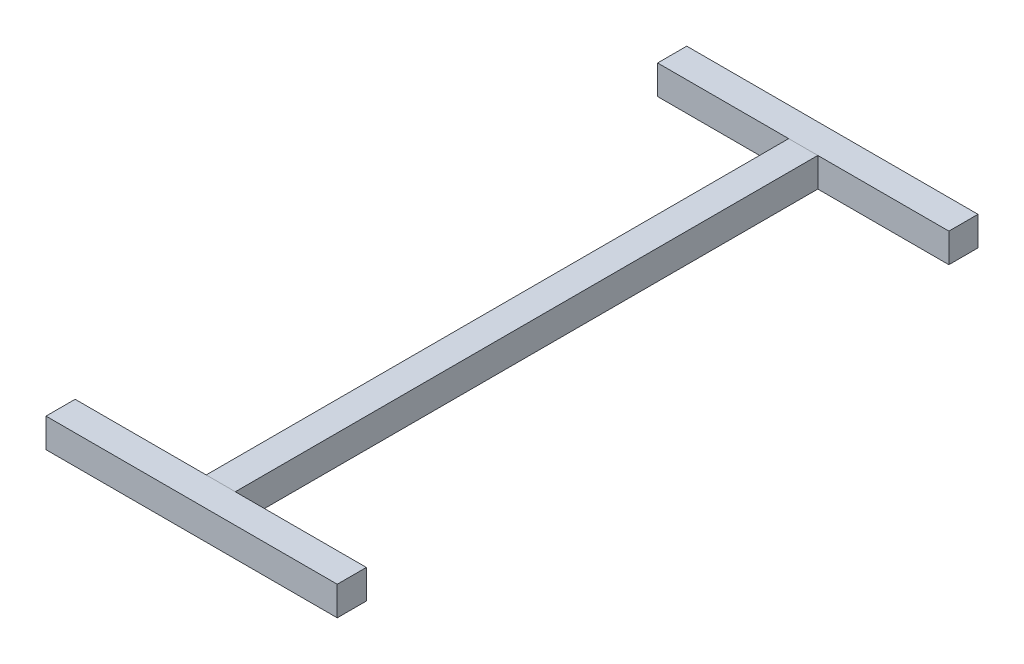
ISO-10303-21;
HEADER;
FILE_DESCRIPTION(('STEP AP214'),'2;1');
FILE_NAME('part.step','',(''),(''),'','','');
FILE_SCHEMA(('AUTOMOTIVE_DESIGN { 1 0 10303 214 1 1 1 1 }'));
ENDSEC;
DATA;
#1=APPLICATION_CONTEXT('core data for automotive mechanical design processes');
#2=APPLICATION_PROTOCOL_DEFINITION('international standard','automotive_design',2000,#1);
#3=PRODUCT_CONTEXT('',#1,'mechanical');
#4=PRODUCT('Part','Part','',(#3));
#5=PRODUCT_RELATED_PRODUCT_CATEGORY('part','',(#4));
#6=PRODUCT_DEFINITION_FORMATION('','',#4);
#7=PRODUCT_DEFINITION_CONTEXT('part definition',#1,'design');
#8=PRODUCT_DEFINITION('design','',#6,#7);
#9=PRODUCT_DEFINITION_SHAPE('','',#8);
#10=(LENGTH_UNIT() NAMED_UNIT(*) SI_UNIT(.MILLI.,.METRE.));
#11=(NAMED_UNIT(*) PLANE_ANGLE_UNIT() SI_UNIT($,.RADIAN.));
#12=(NAMED_UNIT(*) SI_UNIT($,.STERADIAN.) SOLID_ANGLE_UNIT());
#13=UNCERTAINTY_MEASURE_WITH_UNIT(LENGTH_MEASURE(1.E-05),#10,'distance_accuracy_value','');
#14=(GEOMETRIC_REPRESENTATION_CONTEXT(3) GLOBAL_UNCERTAINTY_ASSIGNED_CONTEXT((#13)) GLOBAL_UNIT_ASSIGNED_CONTEXT((#10,
#11,#12)) REPRESENTATION_CONTEXT('',''));
#15=CARTESIAN_POINT('',(0.,0.,0.));
#16=DIRECTION('',(0.,0.,1.));
#17=DIRECTION('',(1.,0.,0.));
#18=AXIS2_PLACEMENT_3D('',#15,#16,#17);
#19=CARTESIAN_POINT('',(100.,10.,200.));
#20=DIRECTION('',(0.,0.,1.));
#21=DIRECTION('',(-1.,0.,0.));
#22=AXIS2_PLACEMENT_3D('',#19,#20,#21);
#23=PLANE('',#22);
#24=DIRECTION('',(0.,-1.,0.));
#25=VECTOR('',#24,1.);
#26=CARTESIAN_POINT('',(-100.,10.,200.));
#27=LINE('',#26,#25);
#28=CARTESIAN_POINT('',(-100.,10.,200.));
#29=VERTEX_POINT('',#28);
#30=CARTESIAN_POINT('',(-100.,-10.,200.));
#31=VERTEX_POINT('',#30);
#32=EDGE_CURVE('E110',#29,#31,#27,.T.);
#33=ORIENTED_EDGE('',*,*,#32,.F.);
#34=DIRECTION('',(-1.,0.,0.));
#35=VECTOR('',#34,1.);
#36=CARTESIAN_POINT('',(100.,10.,200.));
#37=LINE('',#36,#35);
#38=CARTESIAN_POINT('',(100.,10.,200.));
#39=VERTEX_POINT('',#38);
#40=EDGE_CURVE('E109',#39,#29,#37,.T.);
#41=ORIENTED_EDGE('',*,*,#40,.F.);
#42=DIRECTION('',(0.,-1.,0.));
#43=VECTOR('',#42,1.);
#44=CARTESIAN_POINT('',(100.,10.,200.));
#45=LINE('',#44,#43);
#46=CARTESIAN_POINT('',(100.,-10.,200.));
#47=VERTEX_POINT('',#46);
#48=EDGE_CURVE('E104',#39,#47,#45,.T.);
#49=ORIENTED_EDGE('',*,*,#48,.T.);
#50=DIRECTION('',(-1.,0.,0.));
#51=VECTOR('',#50,1.);
#52=CARTESIAN_POINT('',(100.,-10.,200.));
#53=LINE('',#52,#51);
#54=EDGE_CURVE('E12',#47,#31,#53,.T.);
#55=ORIENTED_EDGE('',*,*,#54,.T.);
#56=EDGE_LOOP('',(#33,#41,#49,#55));
#57=FACE_BOUND('',#56,.T.);
#58=ADVANCED_FACE('F47',(#57),#23,.F.);
#59=CARTESIAN_POINT('',(100.,-10.,200.));
#60=DIRECTION('',(0.,1.,0.));
#61=DIRECTION('',(0.,0.,-1.));
#62=AXIS2_PLACEMENT_3D('',#59,#60,#61);
#63=PLANE('',#62);
#64=DIRECTION('',(0.,0.,1.));
#65=VECTOR('',#64,1.);
#66=CARTESIAN_POINT('',(-100.,-10.,200.));
#67=LINE('',#66,#65);
#68=CARTESIAN_POINT('',(-100.,-10.,220.));
#69=VERTEX_POINT('',#68);
#70=EDGE_CURVE('E112',#31,#69,#67,.T.);
#71=ORIENTED_EDGE('',*,*,#70,.F.);
#72=ORIENTED_EDGE('',*,*,#54,.F.);
#73=DIRECTION('',(0.,0.,1.));
#74=VECTOR('',#73,1.);
#75=CARTESIAN_POINT('',(100.,-10.,200.));
#76=LINE('',#75,#74);
#77=CARTESIAN_POINT('',(100.,-10.,220.));
#78=VERTEX_POINT('',#77);
#79=EDGE_CURVE('E88',#47,#78,#76,.T.);
#80=ORIENTED_EDGE('',*,*,#79,.T.);
#81=DIRECTION('',(-1.,0.,0.));
#82=VECTOR('',#81,1.);
#83=CARTESIAN_POINT('',(100.,-10.,220.));
#84=LINE('',#83,#82);
#85=EDGE_CURVE('E55',#78,#69,#84,.T.);
#86=ORIENTED_EDGE('',*,*,#85,.T.);
#87=EDGE_LOOP('',(#71,#72,#80,#86));
#88=FACE_BOUND('',#87,.T.);
#89=ADVANCED_FACE('F102',(#88),#63,.F.);
#90=CARTESIAN_POINT('',(100.,10.,220.));
#91=DIRECTION('',(0.,0.,-1.));
#92=DIRECTION('',(1.,0.,0.));
#93=AXIS2_PLACEMENT_3D('',#90,#91,#92);
#94=PLANE('',#93);
#95=DIRECTION('',(0.,1.,0.));
#96=VECTOR('',#95,1.);
#97=CARTESIAN_POINT('',(-100.,10.,220.));
#98=LINE('',#97,#96);
#99=CARTESIAN_POINT('',(-100.,10.,220.));
#100=VERTEX_POINT('',#99);
#101=EDGE_CURVE('E98',#69,#100,#98,.T.);
#102=ORIENTED_EDGE('',*,*,#101,.F.);
#103=ORIENTED_EDGE('',*,*,#85,.F.);
#104=DIRECTION('',(0.,1.,0.));
#105=VECTOR('',#104,1.);
#106=CARTESIAN_POINT('',(100.,10.,220.));
#107=LINE('',#106,#105);
#108=CARTESIAN_POINT('',(100.,10.,220.));
#109=VERTEX_POINT('',#108);
#110=EDGE_CURVE('E91',#78,#109,#107,.T.);
#111=ORIENTED_EDGE('',*,*,#110,.T.);
#112=DIRECTION('',(-1.,0.,0.));
#113=VECTOR('',#112,1.);
#114=CARTESIAN_POINT('',(100.,10.,220.));
#115=LINE('',#114,#113);
#116=EDGE_CURVE('E101',#109,#100,#115,.T.);
#117=ORIENTED_EDGE('',*,*,#116,.T.);
#118=EDGE_LOOP('',(#102,#103,#111,#117));
#119=FACE_BOUND('',#118,.T.);
#120=ADVANCED_FACE('F97',(#119),#94,.F.);
#121=CARTESIAN_POINT('',(100.,10.,200.));
#122=DIRECTION('',(0.,-1.,0.));
#123=DIRECTION('',(0.,0.,1.));
#124=AXIS2_PLACEMENT_3D('',#121,#122,#123);
#125=PLANE('',#124);
#126=DIRECTION('',(0.,0.,-1.));
#127=VECTOR('',#126,1.);
#128=CARTESIAN_POINT('',(-100.,10.,200.));
#129=LINE('',#128,#127);
#130=EDGE_CURVE('E77',#100,#29,#129,.T.);
#131=ORIENTED_EDGE('',*,*,#130,.F.);
#132=ORIENTED_EDGE('',*,*,#116,.F.);
#133=DIRECTION('',(0.,0.,-1.));
#134=VECTOR('',#133,1.);
#135=CARTESIAN_POINT('',(100.,10.,200.));
#136=LINE('',#135,#134);
#137=EDGE_CURVE('E63',#109,#39,#136,.T.);
#138=ORIENTED_EDGE('',*,*,#137,.T.);
#139=ORIENTED_EDGE('',*,*,#40,.T.);
#140=EDGE_LOOP('',(#131,#132,#138,#139));
#141=FACE_BOUND('',#140,.T.);
#142=ADVANCED_FACE('F121',(#141),#125,.F.);
#143=CARTESIAN_POINT('',(100.,0.,0.));
#144=DIRECTION('',(1.,0.,0.));
#145=DIRECTION('',(0.,0.,1.));
#146=AXIS2_PLACEMENT_3D('',#143,#144,#145);
#147=PLANE('',#146);
#148=ORIENTED_EDGE('',*,*,#48,.F.);
#149=ORIENTED_EDGE('',*,*,#137,.F.);
#150=ORIENTED_EDGE('',*,*,#110,.F.);
#151=ORIENTED_EDGE('',*,*,#79,.F.);
#152=EDGE_LOOP('',(#148,#149,#150,#151));
#153=FACE_BOUND('',#152,.T.);
#154=ADVANCED_FACE('F93',(#153),#147,.T.);
#155=CARTESIAN_POINT('',(-100.,0.,0.));
#156=DIRECTION('',(1.,0.,0.));
#157=DIRECTION('',(0.,0.,1.));
#158=AXIS2_PLACEMENT_3D('',#155,#156,#157);
#159=PLANE('',#158);
#160=ORIENTED_EDGE('',*,*,#32,.T.);
#161=ORIENTED_EDGE('',*,*,#70,.T.);
#162=ORIENTED_EDGE('',*,*,#101,.T.);
#163=ORIENTED_EDGE('',*,*,#130,.T.);
#164=EDGE_LOOP('',(#160,#161,#162,#163));
#165=FACE_BOUND('',#164,.T.);
#166=ADVANCED_FACE('F117',(#165),#159,.F.);
#167=CLOSED_SHELL('',(#58,#89,#120,#142,#154,#166));
#168=MANIFOLD_SOLID_BREP('B2',#167);
#169=CARTESIAN_POINT('',(100.,10.,-200.));
#170=DIRECTION('',(0.,0.,-1.));
#171=DIRECTION('',(-1.,0.,0.));
#172=AXIS2_PLACEMENT_3D('',#169,#170,#171);
#173=PLANE('',#172);
#174=DIRECTION('',(0.,-1.,0.));
#175=VECTOR('',#174,1.);
#176=CARTESIAN_POINT('',(-100.,10.,-200.));
#177=LINE('',#176,#175);
#178=CARTESIAN_POINT('',(-100.,10.,-200.));
#179=VERTEX_POINT('',#178);
#180=CARTESIAN_POINT('',(-100.,-10.,-200.));
#181=VERTEX_POINT('',#180);
#182=EDGE_CURVE('E242',#179,#181,#177,.T.);
#183=ORIENTED_EDGE('',*,*,#182,.T.);
#184=DIRECTION('',(-1.,0.,0.));
#185=VECTOR('',#184,1.);
#186=CARTESIAN_POINT('',(100.,-10.,-200.));
#187=LINE('',#186,#185);
#188=CARTESIAN_POINT('',(100.,-10.,-200.));
#189=VERTEX_POINT('',#188);
#190=EDGE_CURVE('E45',#189,#181,#187,.T.);
#191=ORIENTED_EDGE('',*,*,#190,.F.);
#192=DIRECTION('',(0.,-1.,0.));
#193=VECTOR('',#192,1.);
#194=CARTESIAN_POINT('',(100.,10.,-200.));
#195=LINE('',#194,#193);
#196=CARTESIAN_POINT('',(100.,10.,-200.));
#197=VERTEX_POINT('',#196);
#198=EDGE_CURVE('E230',#197,#189,#195,.T.);
#199=ORIENTED_EDGE('',*,*,#198,.F.);
#200=DIRECTION('',(-1.,0.,0.));
#201=VECTOR('',#200,1.);
#202=CARTESIAN_POINT('',(100.,10.,-200.));
#203=LINE('',#202,#201);
#204=EDGE_CURVE('E238',#197,#179,#203,.T.);
#205=ORIENTED_EDGE('',*,*,#204,.T.);
#206=EDGE_LOOP('',(#183,#191,#199,#205));
#207=FACE_BOUND('',#206,.T.);
#208=ADVANCED_FACE('F179',(#207),#173,.F.);
#209=CARTESIAN_POINT('',(100.,-10.,-200.));
#210=DIRECTION('',(0.,1.,0.));
#211=DIRECTION('',(0.,0.,1.));
#212=AXIS2_PLACEMENT_3D('',#209,#210,#211);
#213=PLANE('',#212);
#214=DIRECTION('',(0.,0.,-1.));
#215=VECTOR('',#214,1.);
#216=CARTESIAN_POINT('',(-100.,-10.,-200.));
#217=LINE('',#216,#215);
#218=CARTESIAN_POINT('',(-100.,-10.,-220.));
#219=VERTEX_POINT('',#218);
#220=EDGE_CURVE('E234',#181,#219,#217,.T.);
#221=ORIENTED_EDGE('',*,*,#220,.T.);
#222=DIRECTION('',(-1.,0.,0.));
#223=VECTOR('',#222,1.);
#224=CARTESIAN_POINT('',(100.,-10.,-220.));
#225=LINE('',#224,#223);
#226=CARTESIAN_POINT('',(100.,-10.,-220.));
#227=VERTEX_POINT('',#226);
#228=EDGE_CURVE('E187',#227,#219,#225,.T.);
#229=ORIENTED_EDGE('',*,*,#228,.F.);
#230=DIRECTION('',(0.,0.,-1.));
#231=VECTOR('',#230,1.);
#232=CARTESIAN_POINT('',(100.,-10.,-200.));
#233=LINE('',#232,#231);
#234=EDGE_CURVE('E225',#189,#227,#233,.T.);
#235=ORIENTED_EDGE('',*,*,#234,.F.);
#236=ORIENTED_EDGE('',*,*,#190,.T.);
#237=EDGE_LOOP('',(#221,#229,#235,#236));
#238=FACE_BOUND('',#237,.T.);
#239=ADVANCED_FACE('F233',(#238),#213,.F.);
#240=CARTESIAN_POINT('',(100.,10.,-220.));
#241=DIRECTION('',(0.,0.,1.));
#242=DIRECTION('',(1.,0.,0.));
#243=AXIS2_PLACEMENT_3D('',#240,#241,#242);
#244=PLANE('',#243);
#245=DIRECTION('',(0.,1.,0.));
#246=VECTOR('',#245,1.);
#247=CARTESIAN_POINT('',(-100.,10.,-220.));
#248=LINE('',#247,#246);
#249=CARTESIAN_POINT('',(-100.,10.,-220.));
#250=VERTEX_POINT('',#249);
#251=EDGE_CURVE('E212',#219,#250,#248,.T.);
#252=ORIENTED_EDGE('',*,*,#251,.T.);
#253=DIRECTION('',(-1.,0.,0.));
#254=VECTOR('',#253,1.);
#255=CARTESIAN_POINT('',(100.,10.,-220.));
#256=LINE('',#255,#254);
#257=CARTESIAN_POINT('',(100.,10.,-220.));
#258=VERTEX_POINT('',#257);
#259=EDGE_CURVE('E235',#258,#250,#256,.T.);
#260=ORIENTED_EDGE('',*,*,#259,.F.);
#261=DIRECTION('',(0.,1.,0.));
#262=VECTOR('',#261,1.);
#263=CARTESIAN_POINT('',(100.,10.,-220.));
#264=LINE('',#263,#262);
#265=EDGE_CURVE('E228',#227,#258,#264,.T.);
#266=ORIENTED_EDGE('',*,*,#265,.F.);
#267=ORIENTED_EDGE('',*,*,#228,.T.);
#268=EDGE_LOOP('',(#252,#260,#266,#267));
#269=FACE_BOUND('',#268,.T.);
#270=ADVANCED_FACE('F236',(#269),#244,.F.);
#271=CARTESIAN_POINT('',(100.,10.,-200.));
#272=DIRECTION('',(0.,-1.,0.));
#273=DIRECTION('',(0.,0.,-1.));
#274=AXIS2_PLACEMENT_3D('',#271,#272,#273);
#275=PLANE('',#274);
#276=DIRECTION('',(0.,0.,1.));
#277=VECTOR('',#276,1.);
#278=CARTESIAN_POINT('',(-100.,10.,-200.));
#279=LINE('',#278,#277);
#280=EDGE_CURVE('E218',#250,#179,#279,.T.);
#281=ORIENTED_EDGE('',*,*,#280,.T.);
#282=ORIENTED_EDGE('',*,*,#204,.F.);
#283=DIRECTION('',(0.,0.,1.));
#284=VECTOR('',#283,1.);
#285=CARTESIAN_POINT('',(100.,10.,-200.));
#286=LINE('',#285,#284);
#287=EDGE_CURVE('E195',#258,#197,#286,.T.);
#288=ORIENTED_EDGE('',*,*,#287,.F.);
#289=ORIENTED_EDGE('',*,*,#259,.T.);
#290=EDGE_LOOP('',(#281,#282,#288,#289));
#291=FACE_BOUND('',#290,.T.);
#292=ADVANCED_FACE('F249',(#291),#275,.F.);
#293=CARTESIAN_POINT('',(100.,0.,0.));
#294=DIRECTION('',(1.,0.,0.));
#295=DIRECTION('',(0.,0.,-1.));
#296=AXIS2_PLACEMENT_3D('',#293,#294,#295);
#297=PLANE('',#296);
#298=ORIENTED_EDGE('',*,*,#198,.T.);
#299=ORIENTED_EDGE('',*,*,#234,.T.);
#300=ORIENTED_EDGE('',*,*,#265,.T.);
#301=ORIENTED_EDGE('',*,*,#287,.T.);
#302=EDGE_LOOP('',(#298,#299,#300,#301));
#303=FACE_BOUND('',#302,.T.);
#304=ADVANCED_FACE('F226',(#303),#297,.T.);
#305=CARTESIAN_POINT('',(-100.,0.,0.));
#306=DIRECTION('',(1.,0.,0.));
#307=DIRECTION('',(0.,0.,-1.));
#308=AXIS2_PLACEMENT_3D('',#305,#306,#307);
#309=PLANE('',#308);
#310=ORIENTED_EDGE('',*,*,#182,.F.);
#311=ORIENTED_EDGE('',*,*,#280,.F.);
#312=ORIENTED_EDGE('',*,*,#251,.F.);
#313=ORIENTED_EDGE('',*,*,#220,.F.);
#314=EDGE_LOOP('',(#310,#311,#312,#313));
#315=FACE_BOUND('',#314,.T.);
#316=ADVANCED_FACE('F252',(#315),#309,.F.);
#317=CLOSED_SHELL('',(#208,#239,#270,#292,#304,#316));
#318=MANIFOLD_SOLID_BREP('B6',#317);
#319=CARTESIAN_POINT('',(10.,-10.,200.));
#320=DIRECTION('',(-1.,0.,0.));
#321=DIRECTION('',(0.,0.,1.));
#322=AXIS2_PLACEMENT_3D('',#319,#320,#321);
#323=PLANE('',#322);
#324=DIRECTION('',(0.,1.,0.));
#325=VECTOR('',#324,1.);
#326=CARTESIAN_POINT('',(10.,-10.,-200.));
#327=LINE('',#326,#325);
#328=CARTESIAN_POINT('',(10.,-10.,-200.));
#329=VERTEX_POINT('',#328);
#330=CARTESIAN_POINT('',(10.,10.,-200.));
#331=VERTEX_POINT('',#330);
#332=EDGE_CURVE('E365',#329,#331,#327,.T.);
#333=ORIENTED_EDGE('',*,*,#332,.T.);
#334=DIRECTION('',(0.,0.,-1.));
#335=VECTOR('',#334,1.);
#336=CARTESIAN_POINT('',(10.,10.,200.));
#337=LINE('',#336,#335);
#338=CARTESIAN_POINT('',(10.,10.,200.));
#339=VERTEX_POINT('',#338);
#340=EDGE_CURVE('E177',#339,#331,#337,.T.);
#341=ORIENTED_EDGE('',*,*,#340,.F.);
#342=DIRECTION('',(0.,1.,0.));
#343=VECTOR('',#342,1.);
#344=CARTESIAN_POINT('',(10.,-10.,200.));
#345=LINE('',#344,#343);
#346=CARTESIAN_POINT('',(10.,-10.,200.));
#347=VERTEX_POINT('',#346);
#348=EDGE_CURVE('E351',#347,#339,#345,.T.);
#349=ORIENTED_EDGE('',*,*,#348,.F.);
#350=DIRECTION('',(0.,0.,-1.));
#351=VECTOR('',#350,1.);
#352=CARTESIAN_POINT('',(10.,-10.,200.));
#353=LINE('',#352,#351);
#354=EDGE_CURVE('E318',#347,#329,#353,.T.);
#355=ORIENTED_EDGE('',*,*,#354,.T.);
#356=EDGE_LOOP('',(#333,#341,#349,#355));
#357=FACE_BOUND('',#356,.T.);
#358=ADVANCED_FACE('F302',(#357),#323,.F.);
#359=CARTESIAN_POINT('',(10.,10.,200.));
#360=DIRECTION('',(0.,-1.,0.));
#361=DIRECTION('',(1.,0.,0.));
#362=AXIS2_PLACEMENT_3D('',#359,#360,#361);
#363=PLANE('',#362);
#364=DIRECTION('',(-1.,0.,0.));
#365=VECTOR('',#364,1.);
#366=CARTESIAN_POINT('',(10.,10.,-200.));
#367=LINE('',#366,#365);
#368=CARTESIAN_POINT('',(-10.,10.,-200.));
#369=VERTEX_POINT('',#368);
#370=EDGE_CURVE('E356',#331,#369,#367,.T.);
#371=ORIENTED_EDGE('',*,*,#370,.T.);
#372=DIRECTION('',(0.,0.,-1.));
#373=VECTOR('',#372,1.);
#374=CARTESIAN_POINT('',(-10.,10.,200.));
#375=LINE('',#374,#373);
#376=CARTESIAN_POINT('',(-10.,10.,200.));
#377=VERTEX_POINT('',#376);
#378=EDGE_CURVE('E310',#377,#369,#375,.T.);
#379=ORIENTED_EDGE('',*,*,#378,.F.);
#380=DIRECTION('',(-1.,0.,0.));
#381=VECTOR('',#380,1.);
#382=CARTESIAN_POINT('',(10.,10.,200.));
#383=LINE('',#382,#381);
#384=EDGE_CURVE('E343',#339,#377,#383,.T.);
#385=ORIENTED_EDGE('',*,*,#384,.F.);
#386=ORIENTED_EDGE('',*,*,#340,.T.);
#387=EDGE_LOOP('',(#371,#379,#385,#386));
#388=FACE_BOUND('',#387,.T.);
#389=ADVANCED_FACE('F355',(#388),#363,.F.);
#390=CARTESIAN_POINT('',(-10.,-10.,200.));
#391=DIRECTION('',(-1.,0.,0.));
#392=DIRECTION('',(0.,0.,1.));
#393=AXIS2_PLACEMENT_3D('',#390,#391,#392);
#394=PLANE('',#393);
#395=DIRECTION('',(0.,1.,0.));
#396=VECTOR('',#395,1.);
#397=CARTESIAN_POINT('',(-10.,-10.,-200.));
#398=LINE('',#397,#396);
#399=CARTESIAN_POINT('',(-10.,-10.,-200.));
#400=VERTEX_POINT('',#399);
#401=EDGE_CURVE('E368',#400,#369,#398,.T.);
#402=ORIENTED_EDGE('',*,*,#401,.F.);
#403=DIRECTION('',(0.,0.,-1.));
#404=VECTOR('',#403,1.);
#405=CARTESIAN_POINT('',(-10.,-10.,200.));
#406=LINE('',#405,#404);
#407=CARTESIAN_POINT('',(-10.,-10.,200.));
#408=VERTEX_POINT('',#407);
#409=EDGE_CURVE('E332',#408,#400,#406,.T.);
#410=ORIENTED_EDGE('',*,*,#409,.F.);
#411=DIRECTION('',(0.,1.,0.));
#412=VECTOR('',#411,1.);
#413=CARTESIAN_POINT('',(-10.,-10.,200.));
#414=LINE('',#413,#412);
#415=EDGE_CURVE('E350',#408,#377,#414,.T.);
#416=ORIENTED_EDGE('',*,*,#415,.T.);
#417=ORIENTED_EDGE('',*,*,#378,.T.);
#418=EDGE_LOOP('',(#402,#410,#416,#417));
#419=FACE_BOUND('',#418,.T.);
#420=ADVANCED_FACE('F359',(#419),#394,.T.);
#421=CARTESIAN_POINT('',(10.,-10.,200.));
#422=DIRECTION('',(0.,-1.,0.));
#423=DIRECTION('',(1.,0.,0.));
#424=AXIS2_PLACEMENT_3D('',#421,#422,#423);
#425=PLANE('',#424);
#426=DIRECTION('',(-1.,0.,0.));
#427=VECTOR('',#426,1.);
#428=CARTESIAN_POINT('',(10.,-10.,-200.));
#429=LINE('',#428,#427);
#430=EDGE_CURVE('E370',#329,#400,#429,.T.);
#431=ORIENTED_EDGE('',*,*,#430,.F.);
#432=ORIENTED_EDGE('',*,*,#354,.F.);
#433=DIRECTION('',(-1.,0.,0.));
#434=VECTOR('',#433,1.);
#435=CARTESIAN_POINT('',(10.,-10.,200.));
#436=LINE('',#435,#434);
#437=EDGE_CURVE('E360',#347,#408,#436,.T.);
#438=ORIENTED_EDGE('',*,*,#437,.T.);
#439=ORIENTED_EDGE('',*,*,#409,.T.);
#440=EDGE_LOOP('',(#431,#432,#438,#439));
#441=FACE_BOUND('',#440,.T.);
#442=ADVANCED_FACE('F376',(#441),#425,.T.);
#443=CARTESIAN_POINT('',(0.,0.,200.));
#444=DIRECTION('',(0.,0.,1.));
#445=DIRECTION('',(1.,0.,0.));
#446=AXIS2_PLACEMENT_3D('',#443,#444,#445);
#447=PLANE('',#446);
#448=ORIENTED_EDGE('',*,*,#348,.T.);
#449=ORIENTED_EDGE('',*,*,#384,.T.);
#450=ORIENTED_EDGE('',*,*,#415,.F.);
#451=ORIENTED_EDGE('',*,*,#437,.F.);
#452=EDGE_LOOP('',(#448,#449,#450,#451));
#453=FACE_BOUND('',#452,.T.);
#454=ADVANCED_FACE('F347',(#453),#447,.T.);
#455=CARTESIAN_POINT('',(0.,0.,-200.));
#456=DIRECTION('',(0.,0.,1.));
#457=DIRECTION('',(1.,0.,0.));
#458=AXIS2_PLACEMENT_3D('',#455,#456,#457);
#459=PLANE('',#458);
#460=ORIENTED_EDGE('',*,*,#332,.F.);
#461=ORIENTED_EDGE('',*,*,#430,.T.);
#462=ORIENTED_EDGE('',*,*,#401,.T.);
#463=ORIENTED_EDGE('',*,*,#370,.F.);
#464=EDGE_LOOP('',(#460,#461,#462,#463));
#465=FACE_BOUND('',#464,.T.);
#466=ADVANCED_FACE('F375',(#465),#459,.F.);
#467=CLOSED_SHELL('',(#358,#389,#420,#442,#454,#466));
#468=MANIFOLD_SOLID_BREP('B39',#467);
#469=ADVANCED_BREP_SHAPE_REPRESENTATION('',(#18,#168,#318,#468),#14);
#470=SHAPE_DEFINITION_REPRESENTATION(#9,#469);
ENDSEC;
END-ISO-10303-21;
